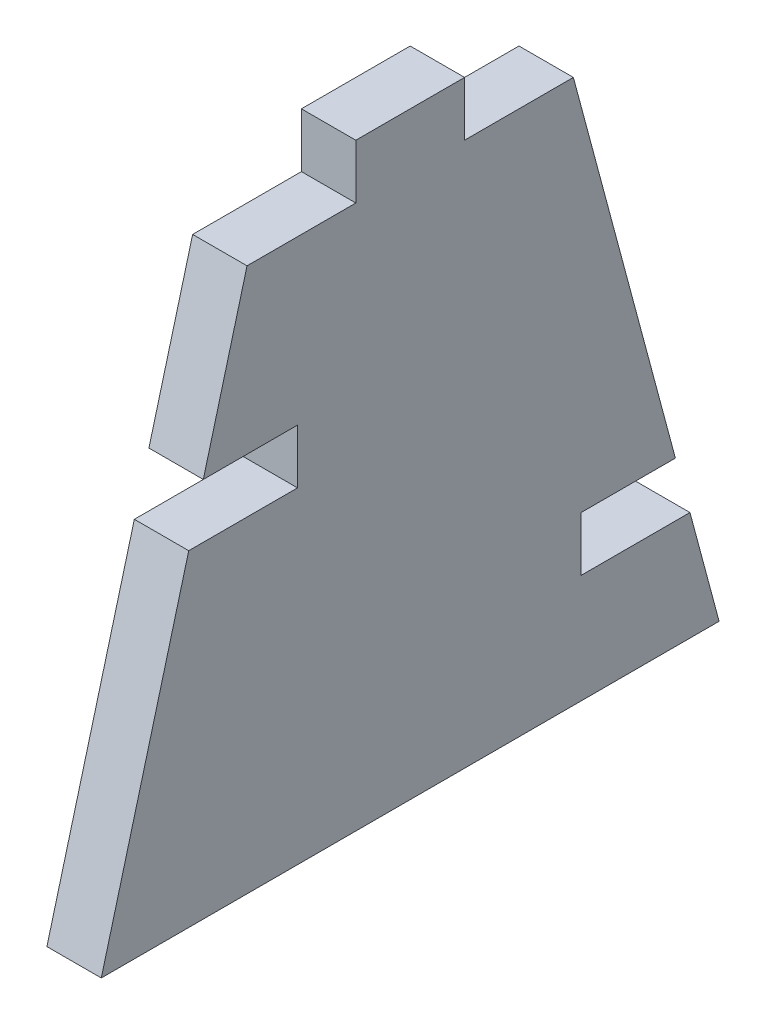
ISO-10303-21;
HEADER;
FILE_DESCRIPTION(('STEP AP214'),'2;1');
FILE_NAME('part.step','',(''),(''),'','','');
FILE_SCHEMA(('AUTOMOTIVE_DESIGN { 1 0 10303 214 1 1 1 1 }'));
ENDSEC;
DATA;
#1=APPLICATION_CONTEXT('core data for automotive mechanical design processes');
#2=APPLICATION_PROTOCOL_DEFINITION('international standard','automotive_design',2000,#1);
#3=PRODUCT_CONTEXT('',#1,'mechanical');
#4=PRODUCT('Part','Part','',(#3));
#5=PRODUCT_RELATED_PRODUCT_CATEGORY('part','',(#4));
#6=PRODUCT_DEFINITION_FORMATION('','',#4);
#7=PRODUCT_DEFINITION_CONTEXT('part definition',#1,'design');
#8=PRODUCT_DEFINITION('design','',#6,#7);
#9=PRODUCT_DEFINITION_SHAPE('','',#8);
#10=(LENGTH_UNIT() NAMED_UNIT(*) SI_UNIT(.MILLI.,.METRE.));
#11=(NAMED_UNIT(*) PLANE_ANGLE_UNIT() SI_UNIT($,.RADIAN.));
#12=(NAMED_UNIT(*) SI_UNIT($,.STERADIAN.) SOLID_ANGLE_UNIT());
#13=UNCERTAINTY_MEASURE_WITH_UNIT(LENGTH_MEASURE(1.E-05),#10,'distance_accuracy_value','');
#14=(GEOMETRIC_REPRESENTATION_CONTEXT(3) GLOBAL_UNCERTAINTY_ASSIGNED_CONTEXT((#13)) GLOBAL_UNIT_ASSIGNED_CONTEXT((#10,
#11,#12)) REPRESENTATION_CONTEXT('',''));
#15=CARTESIAN_POINT('',(0.,0.,0.));
#16=DIRECTION('',(0.,0.,1.));
#17=DIRECTION('',(1.,0.,0.));
#18=AXIS2_PLACEMENT_3D('',#15,#16,#17);
#19=CARTESIAN_POINT('',(10.,0.,56.7949192431127));
#20=DIRECTION('',(0.,-0.258819045102525,-0.965925826289067));
#21=DIRECTION('',(0.,0.965925826289067,-0.258819045102525));
#22=AXIS2_PLACEMENT_3D('',#19,#20,#21);
#23=PLANE('',#22);
#24=DIRECTION('',(0.,-0.965925826289067,0.258819045102525));
#25=VECTOR('',#24,1.);
#26=CARTESIAN_POINT('',(0.,0.,56.7949192431127));
#27=LINE('',#26,#25);
#28=CARTESIAN_POINT('',(0.,60.,40.7179676972451));
#29=VERTEX_POINT('',#28);
#30=CARTESIAN_POINT('',(0.,0.,56.7949192431127));
#31=VERTEX_POINT('',#30);
#32=EDGE_CURVE('E188',#29,#31,#27,.T.);
#33=ORIENTED_EDGE('',*,*,#32,.T.);
#34=DIRECTION('',(-1.,0.,0.));
#35=VECTOR('',#34,1.);
#36=CARTESIAN_POINT('',(10.,0.,56.7949192431127));
#37=LINE('',#36,#35);
#38=CARTESIAN_POINT('',(10.,0.,56.7949192431127));
#39=VERTEX_POINT('',#38);
#40=EDGE_CURVE('E11',#39,#31,#37,.T.);
#41=ORIENTED_EDGE('',*,*,#40,.F.);
#42=DIRECTION('',(0.,-0.965925826289067,0.258819045102525));
#43=VECTOR('',#42,1.);
#44=CARTESIAN_POINT('',(10.,0.,56.7949192431127));
#45=LINE('',#44,#43);
#46=CARTESIAN_POINT('',(10.,60.,40.7179676972451));
#47=VERTEX_POINT('',#46);
#48=EDGE_CURVE('E234',#47,#39,#45,.T.);
#49=ORIENTED_EDGE('',*,*,#48,.F.);
#50=DIRECTION('',(-1.,0.,0.));
#51=VECTOR('',#50,1.);
#52=CARTESIAN_POINT('',(10.,60.,40.7179676972451));
#53=LINE('',#52,#51);
#54=EDGE_CURVE('E184',#47,#29,#53,.T.);
#55=ORIENTED_EDGE('',*,*,#54,.T.);
#56=EDGE_LOOP('',(#33,#41,#49,#55));
#57=FACE_BOUND('',#56,.T.);
#58=ADVANCED_FACE('F39',(#57),#23,.F.);
#59=CARTESIAN_POINT('',(10.,0.,-56.7949192431127));
#60=DIRECTION('',(0.,1.,0.));
#61=DIRECTION('',(0.,0.,1.));
#62=AXIS2_PLACEMENT_3D('',#59,#60,#61);
#63=PLANE('',#62);
#64=DIRECTION('',(0.,0.,-1.));
#65=VECTOR('',#64,1.);
#66=CARTESIAN_POINT('',(0.,0.,-56.7949192431127));
#67=LINE('',#66,#65);
#68=CARTESIAN_POINT('',(0.,0.,-56.7949192431127));
#69=VERTEX_POINT('',#68);
#70=EDGE_CURVE('E192',#31,#69,#67,.T.);
#71=ORIENTED_EDGE('',*,*,#70,.T.);
#72=DIRECTION('',(-1.,0.,0.));
#73=VECTOR('',#72,1.);
#74=CARTESIAN_POINT('',(10.,0.,-56.7949192431127));
#75=LINE('',#74,#73);
#76=CARTESIAN_POINT('',(10.,0.,-56.7949192431127));
#77=VERTEX_POINT('',#76);
#78=EDGE_CURVE('E48',#77,#69,#75,.T.);
#79=ORIENTED_EDGE('',*,*,#78,.F.);
#80=DIRECTION('',(0.,0.,-1.));
#81=VECTOR('',#80,1.);
#82=CARTESIAN_POINT('',(10.,0.,-56.7949192431127));
#83=LINE('',#82,#81);
#84=EDGE_CURVE('E123',#39,#77,#83,.T.);
#85=ORIENTED_EDGE('',*,*,#84,.F.);
#86=ORIENTED_EDGE('',*,*,#40,.T.);
#87=EDGE_LOOP('',(#71,#79,#85,#86));
#88=FACE_BOUND('',#87,.T.);
#89=ADVANCED_FACE('F356',(#88),#63,.F.);
#90=CARTESIAN_POINT('',(10.,0.,-56.7949192431127));
#91=DIRECTION('',(0.,-0.258819045102525,0.965925826289067));
#92=DIRECTION('',(0.,-0.965925826289067,-0.258819045102525));
#93=AXIS2_PLACEMENT_3D('',#90,#91,#92);
#94=PLANE('',#93);
#95=DIRECTION('',(0.,0.965925826289067,0.258819045102525));
#96=VECTOR('',#95,1.);
#97=CARTESIAN_POINT('',(0.,0.,-56.7949192431127));
#98=LINE('',#97,#96);
#99=CARTESIAN_POINT('',(0.,20.,-51.4359353944902));
#100=VERTEX_POINT('',#99);
#101=EDGE_CURVE('E195',#69,#100,#98,.T.);
#102=ORIENTED_EDGE('',*,*,#101,.T.);
#103=DIRECTION('',(-1.,0.,0.));
#104=VECTOR('',#103,1.);
#105=CARTESIAN_POINT('',(10.,20.,-51.4359353944902));
#106=LINE('',#105,#104);
#107=CARTESIAN_POINT('',(10.,20.,-51.4359353944902));
#108=VERTEX_POINT('',#107);
#109=EDGE_CURVE('E277',#108,#100,#106,.T.);
#110=ORIENTED_EDGE('',*,*,#109,.F.);
#111=DIRECTION('',(0.,0.965925826289067,0.258819045102525));
#112=VECTOR('',#111,1.);
#113=CARTESIAN_POINT('',(10.,0.,-56.7949192431127));
#114=LINE('',#113,#112);
#115=EDGE_CURVE('E287',#77,#108,#114,.T.);
#116=ORIENTED_EDGE('',*,*,#115,.F.);
#117=ORIENTED_EDGE('',*,*,#78,.T.);
#118=EDGE_LOOP('',(#102,#110,#116,#117));
#119=FACE_BOUND('',#118,.T.);
#120=ADVANCED_FACE('F285',(#119),#94,.F.);
#121=CARTESIAN_POINT('',(10.,20.,-31.4359353944901));
#122=DIRECTION('',(0.,-1.,0.));
#123=DIRECTION('',(0.,0.,-1.));
#124=AXIS2_PLACEMENT_3D('',#121,#122,#123);
#125=PLANE('',#124);
#126=DIRECTION('',(0.,0.,1.));
#127=VECTOR('',#126,1.);
#128=CARTESIAN_POINT('',(0.,20.,-31.4359353944901));
#129=LINE('',#128,#127);
#130=CARTESIAN_POINT('',(0.,20.,-31.4359353944901));
#131=VERTEX_POINT('',#130);
#132=EDGE_CURVE('E198',#100,#131,#129,.T.);
#133=ORIENTED_EDGE('',*,*,#132,.T.);
#134=DIRECTION('',(-1.,0.,0.));
#135=VECTOR('',#134,1.);
#136=CARTESIAN_POINT('',(10.,20.,-31.4359353944901));
#137=LINE('',#136,#135);
#138=CARTESIAN_POINT('',(10.,20.,-31.4359353944901));
#139=VERTEX_POINT('',#138);
#140=EDGE_CURVE('E273',#139,#131,#137,.T.);
#141=ORIENTED_EDGE('',*,*,#140,.F.);
#142=DIRECTION('',(0.,0.,1.));
#143=VECTOR('',#142,1.);
#144=CARTESIAN_POINT('',(10.,20.,-31.4359353944901));
#145=LINE('',#144,#143);
#146=EDGE_CURVE('E306',#108,#139,#145,.T.);
#147=ORIENTED_EDGE('',*,*,#146,.F.);
#148=ORIENTED_EDGE('',*,*,#109,.T.);
#149=EDGE_LOOP('',(#133,#141,#147,#148));
#150=FACE_BOUND('',#149,.T.);
#151=ADVANCED_FACE('F296',(#150),#125,.F.);
#152=CARTESIAN_POINT('',(10.,30.,-31.4359353944901));
#153=DIRECTION('',(0.,0.,1.));
#154=DIRECTION('',(1.,0.,0.));
#155=AXIS2_PLACEMENT_3D('',#152,#153,#154);
#156=PLANE('',#155);
#157=DIRECTION('',(0.,1.,0.));
#158=VECTOR('',#157,1.);
#159=CARTESIAN_POINT('',(0.,30.,-31.4359353944901));
#160=LINE('',#159,#158);
#161=CARTESIAN_POINT('',(0.,30.,-31.4359353944901));
#162=VERTEX_POINT('',#161);
#163=EDGE_CURVE('E201',#131,#162,#160,.T.);
#164=ORIENTED_EDGE('',*,*,#163,.T.);
#165=DIRECTION('',(-1.,0.,0.));
#166=VECTOR('',#165,1.);
#167=CARTESIAN_POINT('',(10.,30.,-31.4359353944901));
#168=LINE('',#167,#166);
#169=CARTESIAN_POINT('',(10.,30.,-31.4359353944901));
#170=VERTEX_POINT('',#169);
#171=EDGE_CURVE('E269',#170,#162,#168,.T.);
#172=ORIENTED_EDGE('',*,*,#171,.F.);
#173=DIRECTION('',(0.,1.,0.));
#174=VECTOR('',#173,1.);
#175=CARTESIAN_POINT('',(10.,30.,-31.4359353944901));
#176=LINE('',#175,#174);
#177=EDGE_CURVE('E302',#139,#170,#176,.T.);
#178=ORIENTED_EDGE('',*,*,#177,.F.);
#179=ORIENTED_EDGE('',*,*,#140,.T.);
#180=EDGE_LOOP('',(#164,#172,#178,#179));
#181=FACE_BOUND('',#180,.T.);
#182=ADVANCED_FACE('F300',(#181),#156,.F.);
#183=CARTESIAN_POINT('',(10.,30.,-48.7564434701789));
#184=DIRECTION('',(0.,1.,0.));
#185=DIRECTION('',(0.,0.,1.));
#186=AXIS2_PLACEMENT_3D('',#183,#184,#185);
#187=PLANE('',#186);
#188=DIRECTION('',(0.,0.,-1.));
#189=VECTOR('',#188,1.);
#190=CARTESIAN_POINT('',(0.,30.,-48.7564434701789));
#191=LINE('',#190,#189);
#192=CARTESIAN_POINT('',(0.,30.,-48.7564434701789));
#193=VERTEX_POINT('',#192);
#194=EDGE_CURVE('E204',#162,#193,#191,.T.);
#195=ORIENTED_EDGE('',*,*,#194,.T.);
#196=DIRECTION('',(-1.,0.,0.));
#197=VECTOR('',#196,1.);
#198=CARTESIAN_POINT('',(10.,30.,-48.7564434701789));
#199=LINE('',#198,#197);
#200=CARTESIAN_POINT('',(10.,30.,-48.7564434701789));
#201=VERTEX_POINT('',#200);
#202=EDGE_CURVE('E265',#201,#193,#199,.T.);
#203=ORIENTED_EDGE('',*,*,#202,.F.);
#204=DIRECTION('',(0.,0.,-1.));
#205=VECTOR('',#204,1.);
#206=CARTESIAN_POINT('',(10.,30.,-48.7564434701789));
#207=LINE('',#206,#205);
#208=EDGE_CURVE('E305',#170,#201,#207,.T.);
#209=ORIENTED_EDGE('',*,*,#208,.F.);
#210=ORIENTED_EDGE('',*,*,#171,.T.);
#211=EDGE_LOOP('',(#195,#203,#209,#210));
#212=FACE_BOUND('',#211,.T.);
#213=ADVANCED_FACE('F369',(#212),#187,.F.);
#214=CARTESIAN_POINT('',(10.,30.,-48.7564434701789));
#215=DIRECTION('',(0.,-0.258819045102525,0.965925826289067));
#216=DIRECTION('',(0.,-0.965925826289067,-0.258819045102525));
#217=AXIS2_PLACEMENT_3D('',#214,#215,#216);
#218=PLANE('',#217);
#219=DIRECTION('',(0.,0.965925826289067,0.258819045102525));
#220=VECTOR('',#219,1.);
#221=CARTESIAN_POINT('',(0.,30.,-48.7564434701789));
#222=LINE('',#221,#220);
#223=CARTESIAN_POINT('',(0.,99.9999999999999,-30.));
#224=VERTEX_POINT('',#223);
#225=EDGE_CURVE('E207',#193,#224,#222,.T.);
#226=ORIENTED_EDGE('',*,*,#225,.T.);
#227=DIRECTION('',(-1.,0.,0.));
#228=VECTOR('',#227,1.);
#229=CARTESIAN_POINT('',(10.,99.9999999999999,-30.));
#230=LINE('',#229,#228);
#231=CARTESIAN_POINT('',(10.,99.9999999999999,-30.));
#232=VERTEX_POINT('',#231);
#233=EDGE_CURVE('E261',#232,#224,#230,.T.);
#234=ORIENTED_EDGE('',*,*,#233,.F.);
#235=DIRECTION('',(0.,0.965925826289067,0.258819045102525));
#236=VECTOR('',#235,1.);
#237=CARTESIAN_POINT('',(10.,30.,-48.7564434701789));
#238=LINE('',#237,#236);
#239=EDGE_CURVE('E310',#201,#232,#238,.T.);
#240=ORIENTED_EDGE('',*,*,#239,.F.);
#241=ORIENTED_EDGE('',*,*,#202,.T.);
#242=EDGE_LOOP('',(#226,#234,#240,#241));
#243=FACE_BOUND('',#242,.T.);
#244=ADVANCED_FACE('F372',(#243),#218,.F.);
#245=CARTESIAN_POINT('',(10.,99.9999999999999,-30.));
#246=DIRECTION('',(0.,-1.,0.));
#247=DIRECTION('',(0.,0.,-1.));
#248=AXIS2_PLACEMENT_3D('',#245,#246,#247);
#249=PLANE('',#248);
#250=DIRECTION('',(0.,0.,1.));
#251=VECTOR('',#250,1.);
#252=CARTESIAN_POINT('',(0.,99.9999999999999,-30.));
#253=LINE('',#252,#251);
#254=CARTESIAN_POINT('',(0.,99.9999999999999,-10.));
#255=VERTEX_POINT('',#254);
#256=EDGE_CURVE('E210',#224,#255,#253,.T.);
#257=ORIENTED_EDGE('',*,*,#256,.T.);
#258=DIRECTION('',(-1.,0.,0.));
#259=VECTOR('',#258,1.);
#260=CARTESIAN_POINT('',(10.,99.9999999999999,-10.));
#261=LINE('',#260,#259);
#262=CARTESIAN_POINT('',(10.,99.9999999999999,-10.));
#263=VERTEX_POINT('',#262);
#264=EDGE_CURVE('E257',#263,#255,#261,.T.);
#265=ORIENTED_EDGE('',*,*,#264,.F.);
#266=DIRECTION('',(0.,0.,1.));
#267=VECTOR('',#266,1.);
#268=CARTESIAN_POINT('',(10.,99.9999999999999,-30.));
#269=LINE('',#268,#267);
#270=EDGE_CURVE('E317',#232,#263,#269,.T.);
#271=ORIENTED_EDGE('',*,*,#270,.F.);
#272=ORIENTED_EDGE('',*,*,#233,.T.);
#273=EDGE_LOOP('',(#257,#265,#271,#272));
#274=FACE_BOUND('',#273,.T.);
#275=ADVANCED_FACE('F376',(#274),#249,.F.);
#276=CARTESIAN_POINT('',(10.,99.9999999999999,-10.));
#277=DIRECTION('',(0.,0.,1.));
#278=DIRECTION('',(1.,0.,0.));
#279=AXIS2_PLACEMENT_3D('',#276,#277,#278);
#280=PLANE('',#279);
#281=DIRECTION('',(0.,1.,0.));
#282=VECTOR('',#281,1.);
#283=CARTESIAN_POINT('',(0.,99.9999999999999,-10.));
#284=LINE('',#283,#282);
#285=CARTESIAN_POINT('',(0.,110.,-10.));
#286=VERTEX_POINT('',#285);
#287=EDGE_CURVE('E213',#255,#286,#284,.T.);
#288=ORIENTED_EDGE('',*,*,#287,.T.);
#289=DIRECTION('',(-1.,0.,0.));
#290=VECTOR('',#289,1.);
#291=CARTESIAN_POINT('',(10.,110.,-10.));
#292=LINE('',#291,#290);
#293=CARTESIAN_POINT('',(10.,110.,-10.));
#294=VERTEX_POINT('',#293);
#295=EDGE_CURVE('E253',#294,#286,#292,.T.);
#296=ORIENTED_EDGE('',*,*,#295,.F.);
#297=DIRECTION('',(0.,1.,0.));
#298=VECTOR('',#297,1.);
#299=CARTESIAN_POINT('',(10.,99.9999999999999,-10.));
#300=LINE('',#299,#298);
#301=EDGE_CURVE('E320',#263,#294,#300,.T.);
#302=ORIENTED_EDGE('',*,*,#301,.F.);
#303=ORIENTED_EDGE('',*,*,#264,.T.);
#304=EDGE_LOOP('',(#288,#296,#302,#303));
#305=FACE_BOUND('',#304,.T.);
#306=ADVANCED_FACE('F380',(#305),#280,.F.);
#307=CARTESIAN_POINT('',(10.,110.,10.));
#308=DIRECTION('',(0.,-1.,0.));
#309=DIRECTION('',(0.,0.,-1.));
#310=AXIS2_PLACEMENT_3D('',#307,#308,#309);
#311=PLANE('',#310);
#312=DIRECTION('',(0.,0.,1.));
#313=VECTOR('',#312,1.);
#314=CARTESIAN_POINT('',(0.,110.,10.));
#315=LINE('',#314,#313);
#316=CARTESIAN_POINT('',(0.,110.,10.));
#317=VERTEX_POINT('',#316);
#318=EDGE_CURVE('E216',#286,#317,#315,.T.);
#319=ORIENTED_EDGE('',*,*,#318,.T.);
#320=DIRECTION('',(-1.,0.,0.));
#321=VECTOR('',#320,1.);
#322=CARTESIAN_POINT('',(10.,110.,10.));
#323=LINE('',#322,#321);
#324=CARTESIAN_POINT('',(10.,110.,10.));
#325=VERTEX_POINT('',#324);
#326=EDGE_CURVE('E249',#325,#317,#323,.T.);
#327=ORIENTED_EDGE('',*,*,#326,.F.);
#328=DIRECTION('',(0.,0.,1.));
#329=VECTOR('',#328,1.);
#330=CARTESIAN_POINT('',(10.,110.,10.));
#331=LINE('',#330,#329);
#332=EDGE_CURVE('E323',#294,#325,#331,.T.);
#333=ORIENTED_EDGE('',*,*,#332,.F.);
#334=ORIENTED_EDGE('',*,*,#295,.T.);
#335=EDGE_LOOP('',(#319,#327,#333,#334));
#336=FACE_BOUND('',#335,.T.);
#337=ADVANCED_FACE('F384',(#336),#311,.F.);
#338=CARTESIAN_POINT('',(10.,100.,10.));
#339=DIRECTION('',(0.,0.,-1.));
#340=DIRECTION('',(-1.,0.,0.));
#341=AXIS2_PLACEMENT_3D('',#338,#339,#340);
#342=PLANE('',#341);
#343=DIRECTION('',(0.,-1.,0.));
#344=VECTOR('',#343,1.);
#345=CARTESIAN_POINT('',(0.,100.,10.));
#346=LINE('',#345,#344);
#347=CARTESIAN_POINT('',(0.,100.,10.));
#348=VERTEX_POINT('',#347);
#349=EDGE_CURVE('E219',#317,#348,#346,.T.);
#350=ORIENTED_EDGE('',*,*,#349,.T.);
#351=DIRECTION('',(-1.,0.,0.));
#352=VECTOR('',#351,1.);
#353=CARTESIAN_POINT('',(10.,100.,10.));
#354=LINE('',#353,#352);
#355=CARTESIAN_POINT('',(10.,100.,10.));
#356=VERTEX_POINT('',#355);
#357=EDGE_CURVE('E245',#356,#348,#354,.T.);
#358=ORIENTED_EDGE('',*,*,#357,.F.);
#359=DIRECTION('',(0.,-1.,0.));
#360=VECTOR('',#359,1.);
#361=CARTESIAN_POINT('',(10.,100.,10.));
#362=LINE('',#361,#360);
#363=EDGE_CURVE('E326',#325,#356,#362,.T.);
#364=ORIENTED_EDGE('',*,*,#363,.F.);
#365=ORIENTED_EDGE('',*,*,#326,.T.);
#366=EDGE_LOOP('',(#350,#358,#364,#365));
#367=FACE_BOUND('',#366,.T.);
#368=ADVANCED_FACE('F388',(#367),#342,.F.);
#369=CARTESIAN_POINT('',(10.,100.,30.));
#370=DIRECTION('',(0.,-1.,0.));
#371=DIRECTION('',(0.,0.,-1.));
#372=AXIS2_PLACEMENT_3D('',#369,#370,#371);
#373=PLANE('',#372);
#374=DIRECTION('',(0.,0.,1.));
#375=VECTOR('',#374,1.);
#376=CARTESIAN_POINT('',(0.,100.,30.));
#377=LINE('',#376,#375);
#378=CARTESIAN_POINT('',(0.,100.,30.));
#379=VERTEX_POINT('',#378);
#380=EDGE_CURVE('E222',#348,#379,#377,.T.);
#381=ORIENTED_EDGE('',*,*,#380,.T.);
#382=DIRECTION('',(-1.,0.,0.));
#383=VECTOR('',#382,1.);
#384=CARTESIAN_POINT('',(10.,100.,30.));
#385=LINE('',#384,#383);
#386=CARTESIAN_POINT('',(10.,100.,30.));
#387=VERTEX_POINT('',#386);
#388=EDGE_CURVE('E241',#387,#379,#385,.T.);
#389=ORIENTED_EDGE('',*,*,#388,.F.);
#390=DIRECTION('',(0.,0.,1.));
#391=VECTOR('',#390,1.);
#392=CARTESIAN_POINT('',(10.,100.,30.));
#393=LINE('',#392,#391);
#394=EDGE_CURVE('E329',#356,#387,#393,.T.);
#395=ORIENTED_EDGE('',*,*,#394,.F.);
#396=ORIENTED_EDGE('',*,*,#357,.T.);
#397=EDGE_LOOP('',(#381,#389,#395,#396));
#398=FACE_BOUND('',#397,.T.);
#399=ADVANCED_FACE('F337',(#398),#373,.F.);
#400=CARTESIAN_POINT('',(10.,70.,38.0384757729338));
#401=DIRECTION('',(0.,-0.258819045102524,-0.965925826289067));
#402=DIRECTION('',(0.,0.965925826289067,-0.258819045102524));
#403=AXIS2_PLACEMENT_3D('',#400,#401,#402);
#404=PLANE('',#403);
#405=DIRECTION('',(0.,-0.965925826289067,0.258819045102524));
#406=VECTOR('',#405,1.);
#407=CARTESIAN_POINT('',(0.,70.,38.0384757729338));
#408=LINE('',#407,#406);
#409=CARTESIAN_POINT('',(0.,70.,38.0384757729338));
#410=VERTEX_POINT('',#409);
#411=EDGE_CURVE('E225',#379,#410,#408,.T.);
#412=ORIENTED_EDGE('',*,*,#411,.T.);
#413=DIRECTION('',(-1.,0.,0.));
#414=VECTOR('',#413,1.);
#415=CARTESIAN_POINT('',(10.,70.,38.0384757729338));
#416=LINE('',#415,#414);
#417=CARTESIAN_POINT('',(10.,70.,38.0384757729338));
#418=VERTEX_POINT('',#417);
#419=EDGE_CURVE('E177',#418,#410,#416,.T.);
#420=ORIENTED_EDGE('',*,*,#419,.F.);
#421=DIRECTION('',(0.,-0.965925826289067,0.258819045102524));
#422=VECTOR('',#421,1.);
#423=CARTESIAN_POINT('',(10.,70.,38.0384757729338));
#424=LINE('',#423,#422);
#425=EDGE_CURVE('E166',#387,#418,#424,.T.);
#426=ORIENTED_EDGE('',*,*,#425,.F.);
#427=ORIENTED_EDGE('',*,*,#388,.T.);
#428=EDGE_LOOP('',(#412,#420,#426,#427));
#429=FACE_BOUND('',#428,.T.);
#430=ADVANCED_FACE('F341',(#429),#404,.F.);
#431=CARTESIAN_POINT('',(10.,70.,38.0384757729338));
#432=DIRECTION('',(0.,1.,0.));
#433=DIRECTION('',(0.,0.,1.));
#434=AXIS2_PLACEMENT_3D('',#431,#432,#433);
#435=PLANE('',#434);
#436=DIRECTION('',(0.,0.,-1.));
#437=VECTOR('',#436,1.);
#438=CARTESIAN_POINT('',(0.,70.,38.0384757729338));
#439=LINE('',#438,#437);
#440=CARTESIAN_POINT('',(0.,70.,20.7179676972451));
#441=VERTEX_POINT('',#440);
#442=EDGE_CURVE('E175',#410,#441,#439,.T.);
#443=ORIENTED_EDGE('',*,*,#442,.T.);
#444=DIRECTION('',(-1.,0.,0.));
#445=VECTOR('',#444,1.);
#446=CARTESIAN_POINT('',(10.,70.,20.7179676972451));
#447=LINE('',#446,#445);
#448=CARTESIAN_POINT('',(10.,70.,20.7179676972451));
#449=VERTEX_POINT('',#448);
#450=EDGE_CURVE('E172',#449,#441,#447,.T.);
#451=ORIENTED_EDGE('',*,*,#450,.F.);
#452=DIRECTION('',(0.,0.,-1.));
#453=VECTOR('',#452,1.);
#454=CARTESIAN_POINT('',(10.,70.,38.0384757729338));
#455=LINE('',#454,#453);
#456=EDGE_CURVE('E160',#418,#449,#455,.T.);
#457=ORIENTED_EDGE('',*,*,#456,.F.);
#458=ORIENTED_EDGE('',*,*,#419,.T.);
#459=EDGE_LOOP('',(#443,#451,#457,#458));
#460=FACE_BOUND('',#459,.T.);
#461=ADVANCED_FACE('F173',(#460),#435,.F.);
#462=CARTESIAN_POINT('',(10.,70.,20.7179676972451));
#463=DIRECTION('',(0.,0.,-1.));
#464=DIRECTION('',(0.,1.,0.));
#465=AXIS2_PLACEMENT_3D('',#462,#463,#464);
#466=PLANE('',#465);
#467=DIRECTION('',(0.,-1.,0.));
#468=VECTOR('',#467,1.);
#469=CARTESIAN_POINT('',(0.,70.,20.7179676972451));
#470=LINE('',#469,#468);
#471=CARTESIAN_POINT('',(0.,60.,20.7179676972451));
#472=VERTEX_POINT('',#471);
#473=EDGE_CURVE('E109',#441,#472,#470,.T.);
#474=ORIENTED_EDGE('',*,*,#473,.T.);
#475=DIRECTION('',(-1.,0.,0.));
#476=VECTOR('',#475,1.);
#477=CARTESIAN_POINT('',(10.,60.,20.7179676972451));
#478=LINE('',#477,#476);
#479=CARTESIAN_POINT('',(10.,60.,20.7179676972451));
#480=VERTEX_POINT('',#479);
#481=EDGE_CURVE('E178',#480,#472,#478,.T.);
#482=ORIENTED_EDGE('',*,*,#481,.F.);
#483=DIRECTION('',(0.,-1.,0.));
#484=VECTOR('',#483,1.);
#485=CARTESIAN_POINT('',(10.,70.,20.7179676972451));
#486=LINE('',#485,#484);
#487=EDGE_CURVE('E164',#449,#480,#486,.T.);
#488=ORIENTED_EDGE('',*,*,#487,.F.);
#489=ORIENTED_EDGE('',*,*,#450,.T.);
#490=EDGE_LOOP('',(#474,#482,#488,#489));
#491=FACE_BOUND('',#490,.T.);
#492=ADVANCED_FACE('F180',(#491),#466,.F.);
#493=CARTESIAN_POINT('',(10.,60.,20.7179676972451));
#494=DIRECTION('',(0.,-1.,0.));
#495=DIRECTION('',(0.,0.,-1.));
#496=AXIS2_PLACEMENT_3D('',#493,#494,#495);
#497=PLANE('',#496);
#498=DIRECTION('',(0.,0.,1.));
#499=VECTOR('',#498,1.);
#500=CARTESIAN_POINT('',(0.,60.,20.7179676972451));
#501=LINE('',#500,#499);
#502=EDGE_CURVE('E115',#472,#29,#501,.T.);
#503=ORIENTED_EDGE('',*,*,#502,.T.);
#504=ORIENTED_EDGE('',*,*,#54,.F.);
#505=DIRECTION('',(0.,0.,1.));
#506=VECTOR('',#505,1.);
#507=CARTESIAN_POINT('',(10.,60.,20.7179676972451));
#508=LINE('',#507,#506);
#509=EDGE_CURVE('E56',#480,#47,#508,.T.);
#510=ORIENTED_EDGE('',*,*,#509,.F.);
#511=ORIENTED_EDGE('',*,*,#481,.T.);
#512=EDGE_LOOP('',(#503,#504,#510,#511));
#513=FACE_BOUND('',#512,.T.);
#514=ADVANCED_FACE('F345',(#513),#497,.F.);
#515=CARTESIAN_POINT('',(10.,0.,0.));
#516=DIRECTION('',(1.,0.,0.));
#517=DIRECTION('',(0.,0.,-1.));
#518=AXIS2_PLACEMENT_3D('',#515,#516,#517);
#519=PLANE('',#518);
#520=ORIENTED_EDGE('',*,*,#48,.T.);
#521=ORIENTED_EDGE('',*,*,#84,.T.);
#522=ORIENTED_EDGE('',*,*,#115,.T.);
#523=ORIENTED_EDGE('',*,*,#146,.T.);
#524=ORIENTED_EDGE('',*,*,#177,.T.);
#525=ORIENTED_EDGE('',*,*,#208,.T.);
#526=ORIENTED_EDGE('',*,*,#239,.T.);
#527=ORIENTED_EDGE('',*,*,#270,.T.);
#528=ORIENTED_EDGE('',*,*,#301,.T.);
#529=ORIENTED_EDGE('',*,*,#332,.T.);
#530=ORIENTED_EDGE('',*,*,#363,.T.);
#531=ORIENTED_EDGE('',*,*,#394,.T.);
#532=ORIENTED_EDGE('',*,*,#425,.T.);
#533=ORIENTED_EDGE('',*,*,#456,.T.);
#534=ORIENTED_EDGE('',*,*,#487,.T.);
#535=ORIENTED_EDGE('',*,*,#509,.T.);
#536=EDGE_LOOP('',(#520,#521,#522,#523,#524,#525,#526,#527,#528,#529,#530,#531,#532,#533,#534,#535));
#537=FACE_BOUND('',#536,.T.);
#538=ADVANCED_FACE('F162',(#537),#519,.T.);
#539=CARTESIAN_POINT('',(0.,0.,0.));
#540=DIRECTION('',(1.,0.,0.));
#541=DIRECTION('',(0.,0.,-1.));
#542=AXIS2_PLACEMENT_3D('',#539,#540,#541);
#543=PLANE('',#542);
#544=ORIENTED_EDGE('',*,*,#32,.F.);
#545=ORIENTED_EDGE('',*,*,#502,.F.);
#546=ORIENTED_EDGE('',*,*,#473,.F.);
#547=ORIENTED_EDGE('',*,*,#442,.F.);
#548=ORIENTED_EDGE('',*,*,#411,.F.);
#549=ORIENTED_EDGE('',*,*,#380,.F.);
#550=ORIENTED_EDGE('',*,*,#349,.F.);
#551=ORIENTED_EDGE('',*,*,#318,.F.);
#552=ORIENTED_EDGE('',*,*,#287,.F.);
#553=ORIENTED_EDGE('',*,*,#256,.F.);
#554=ORIENTED_EDGE('',*,*,#225,.F.);
#555=ORIENTED_EDGE('',*,*,#194,.F.);
#556=ORIENTED_EDGE('',*,*,#163,.F.);
#557=ORIENTED_EDGE('',*,*,#132,.F.);
#558=ORIENTED_EDGE('',*,*,#101,.F.);
#559=ORIENTED_EDGE('',*,*,#70,.F.);
#560=EDGE_LOOP('',(#544,#545,#546,#547,#548,#549,#550,#551,#552,#553,#554,#555,#556,#557,#558,#559));
#561=FACE_BOUND('',#560,.T.);
#562=ADVANCED_FACE('F291',(#561),#543,.F.);
#563=CLOSED_SHELL('',(#58,#89,#120,#151,#182,#213,#244,#275,#306,#337,#368,#399,#430,#461,#492,
#514,#538,#562));
#564=MANIFOLD_SOLID_BREP('B2',#563);
#565=ADVANCED_BREP_SHAPE_REPRESENTATION('',(#18,#564),#14);
#566=SHAPE_DEFINITION_REPRESENTATION(#9,#565);
ENDSEC;
END-ISO-10303-21;
